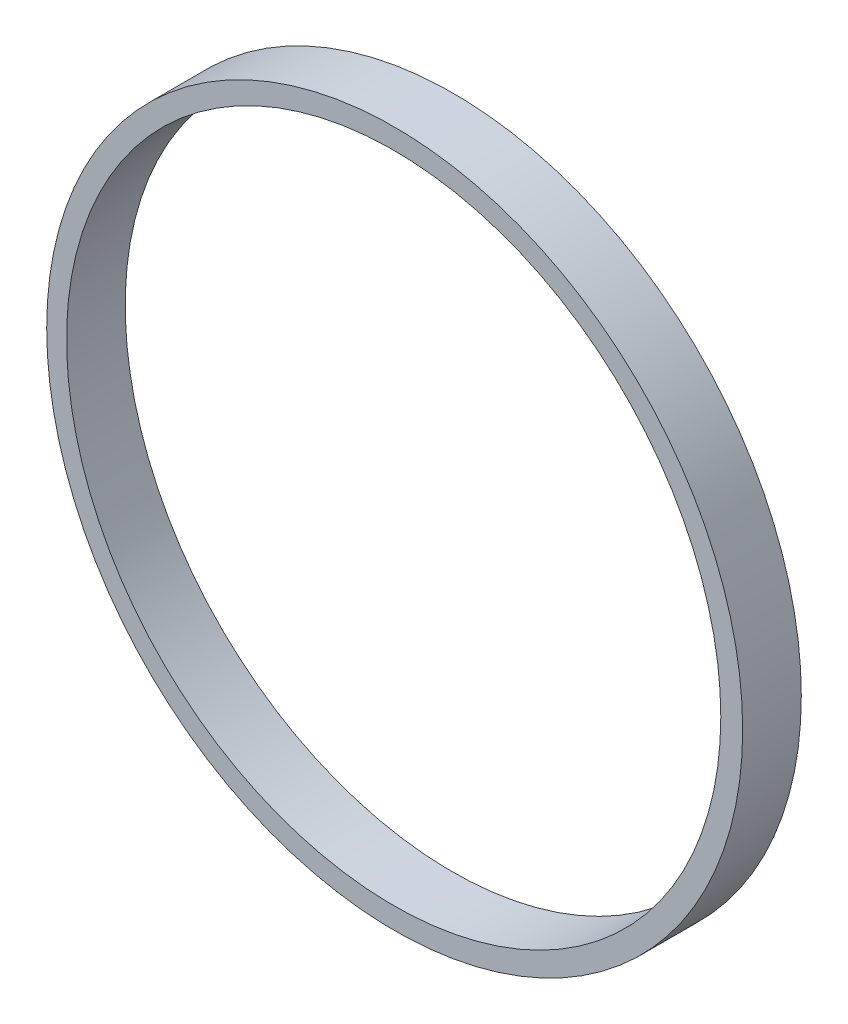
ISO-10303-21;
HEADER;
FILE_DESCRIPTION(('STEP AP214'),'2;1');
FILE_NAME('part.step','',(''),(''),'','','');
FILE_SCHEMA(('AUTOMOTIVE_DESIGN { 1 0 10303 214 1 1 1 1 }'));
ENDSEC;
DATA;
#1=APPLICATION_CONTEXT('core data for automotive mechanical design processes');
#2=APPLICATION_PROTOCOL_DEFINITION('international standard','automotive_design',2000,#1);
#3=PRODUCT_CONTEXT('',#1,'mechanical');
#4=PRODUCT('Part','Part','',(#3));
#5=PRODUCT_RELATED_PRODUCT_CATEGORY('part','',(#4));
#6=PRODUCT_DEFINITION_FORMATION('','',#4);
#7=PRODUCT_DEFINITION_CONTEXT('part definition',#1,'design');
#8=PRODUCT_DEFINITION('design','',#6,#7);
#9=PRODUCT_DEFINITION_SHAPE('','',#8);
#10=(LENGTH_UNIT() NAMED_UNIT(*) SI_UNIT(.MILLI.,.METRE.));
#11=(NAMED_UNIT(*) PLANE_ANGLE_UNIT() SI_UNIT($,.RADIAN.));
#12=(NAMED_UNIT(*) SI_UNIT($,.STERADIAN.) SOLID_ANGLE_UNIT());
#13=UNCERTAINTY_MEASURE_WITH_UNIT(LENGTH_MEASURE(1.E-05),#10,'distance_accuracy_value','');
#14=(GEOMETRIC_REPRESENTATION_CONTEXT(3) GLOBAL_UNCERTAINTY_ASSIGNED_CONTEXT((#13)) GLOBAL_UNIT_ASSIGNED_CONTEXT((#10,
#11,#12)) REPRESENTATION_CONTEXT('',''));
#15=CARTESIAN_POINT('',(0.,0.,0.));
#16=DIRECTION('',(0.,0.,1.));
#17=DIRECTION('',(1.,0.,0.));
#18=AXIS2_PLACEMENT_3D('',#15,#16,#17);
#19=CARTESIAN_POINT('',(1.20146771143137E-05,0.00183567864775296,-27.0699909937554));
#20=DIRECTION('',(-1.02259922170748E-13,0.,1.));
#21=DIRECTION('',(-1.,0.,-1.02259922170748E-13));
#22=AXIS2_PLACEMENT_3D('',#19,#20,#21);
#23=CYLINDRICAL_SURFACE('',#22,35.25);
#24=CARTESIAN_POINT('',(1.20146778482987E-05,0.00183567864801081,-34.2476317185771));
#25=DIRECTION('',(1.02259922170748E-13,0.,-1.));
#26=DIRECTION('',(-1.,0.,-1.02259922170748E-13));
#27=AXIS2_PLACEMENT_3D('',#24,#25,#26);
#28=CIRCLE('',#27,35.25);
#29=CARTESIAN_POINT('',(35.2500120146778,0.00183567864801513,-34.2476317185735));
#30=VERTEX_POINT('',#29);
#31=EDGE_CURVE('E11',#30,#30,#28,.T.);
#32=ORIENTED_EDGE('',*,*,#31,.T.);
#33=EDGE_LOOP('',(#32));
#34=FACE_BOUND('',#33,.T.);
#35=CARTESIAN_POINT('',(1.20146772022572E-05,0.00183567864778385,-27.9299907324573));
#36=DIRECTION('',(1.02259922170748E-13,0.,-1.));
#37=DIRECTION('',(-1.,0.,-1.02259922170748E-13));
#38=AXIS2_PLACEMENT_3D('',#35,#36,#37);
#39=CIRCLE('',#38,35.25);
#40=CARTESIAN_POINT('',(35.2500120146772,0.00183567864778817,-27.9299907324537));
#41=VERTEX_POINT('',#40);
#42=EDGE_CURVE('E21',#41,#41,#39,.T.);
#43=ORIENTED_EDGE('',*,*,#42,.F.);
#44=EDGE_LOOP('',(#43));
#45=FACE_BOUND('',#44,.T.);
#46=ADVANCED_FACE('F17',(#34,#45),#23,.F.);
#47=CARTESIAN_POINT('',(0.108004329323942,-0.0375670954855488,-27.0699909937554));
#48=DIRECTION('',(-1.02259922170748E-13,0.,1.));
#49=DIRECTION('',(-1.,0.,-1.02259922170748E-13));
#50=AXIS2_PLACEMENT_3D('',#47,#48,#49);
#51=CYLINDRICAL_SURFACE('',#50,37.5);
#52=CARTESIAN_POINT('',(0.108004329324676,-0.037567095485291,-34.2476317185771));
#53=DIRECTION('',(-1.02259922170748E-13,0.,1.));
#54=DIRECTION('',(-1.,0.,-1.02259922170748E-13));
#55=AXIS2_PLACEMENT_3D('',#52,#53,#54);
#56=CIRCLE('',#55,37.5);
#57=CARTESIAN_POINT('',(37.6080043293247,-0.0375670954852955,-34.2476317185733));
#58=VERTEX_POINT('',#57);
#59=EDGE_CURVE('E28',#58,#58,#56,.T.);
#60=ORIENTED_EDGE('',*,*,#59,.T.);
#61=EDGE_LOOP('',(#60));
#62=FACE_BOUND('',#61,.T.);
#63=CARTESIAN_POINT('',(0.10800432932403,-0.0375670954855179,-27.9299907324573));
#64=DIRECTION('',(1.02259922170748E-13,0.,-1.));
#65=DIRECTION('',(-1.,0.,-1.02259922170748E-13));
#66=AXIS2_PLACEMENT_3D('',#63,#64,#65);
#67=CIRCLE('',#66,37.5);
#68=CARTESIAN_POINT('',(37.608004329324,-0.0375670954855225,-27.9299907324534));
#69=VERTEX_POINT('',#68);
#70=EDGE_CURVE('E43',#69,#69,#67,.T.);
#71=ORIENTED_EDGE('',*,*,#70,.T.);
#72=EDGE_LOOP('',(#71));
#73=FACE_BOUND('',#72,.T.);
#74=ADVANCED_FACE('F59',(#62,#73),#51,.T.);
#75=CARTESIAN_POINT('',(0.108004329324676,-0.0375670954852909,-34.2476317185771));
#76=DIRECTION('',(1.02259922170748E-13,0.,-1.));
#77=DIRECTION('',(-0.999999738175226,-0.000723636289364295,-1.02285891626961E-13));
#78=AXIS2_PLACEMENT_3D('',#75,#76,#77);
#79=PLANE('',#78);
#80=ORIENTED_EDGE('',*,*,#59,.F.);
#81=EDGE_LOOP('',(#80));
#82=FACE_BOUND('',#81,.T.);
#83=ORIENTED_EDGE('',*,*,#31,.F.);
#84=EDGE_LOOP('',(#83));
#85=FACE_BOUND('',#84,.T.);
#86=ADVANCED_FACE('F19',(#82,#85),#79,.T.);
#87=CARTESIAN_POINT('',(0.10800432932403,-0.0375670954855179,-27.9299907324573));
#88=DIRECTION('',(1.02259922170748E-13,0.,-1.));
#89=DIRECTION('',(-0.999999738175226,-0.000723636289364295,-1.02285891626961E-13));
#90=AXIS2_PLACEMENT_3D('',#87,#88,#89);
#91=PLANE('',#90);
#92=ORIENTED_EDGE('',*,*,#70,.F.);
#93=EDGE_LOOP('',(#92));
#94=FACE_BOUND('',#93,.T.);
#95=ORIENTED_EDGE('',*,*,#42,.T.);
#96=EDGE_LOOP('',(#95));
#97=FACE_BOUND('',#96,.T.);
#98=ADVANCED_FACE('F44',(#94,#97),#91,.F.);
#99=CLOSED_SHELL('',(#46,#74,#86,#98));
#100=MANIFOLD_SOLID_BREP('B1',#99);
#101=ADVANCED_BREP_SHAPE_REPRESENTATION('',(#18,#100),#14);
#102=SHAPE_DEFINITION_REPRESENTATION(#9,#101);
ENDSEC;
END-ISO-10303-21;
